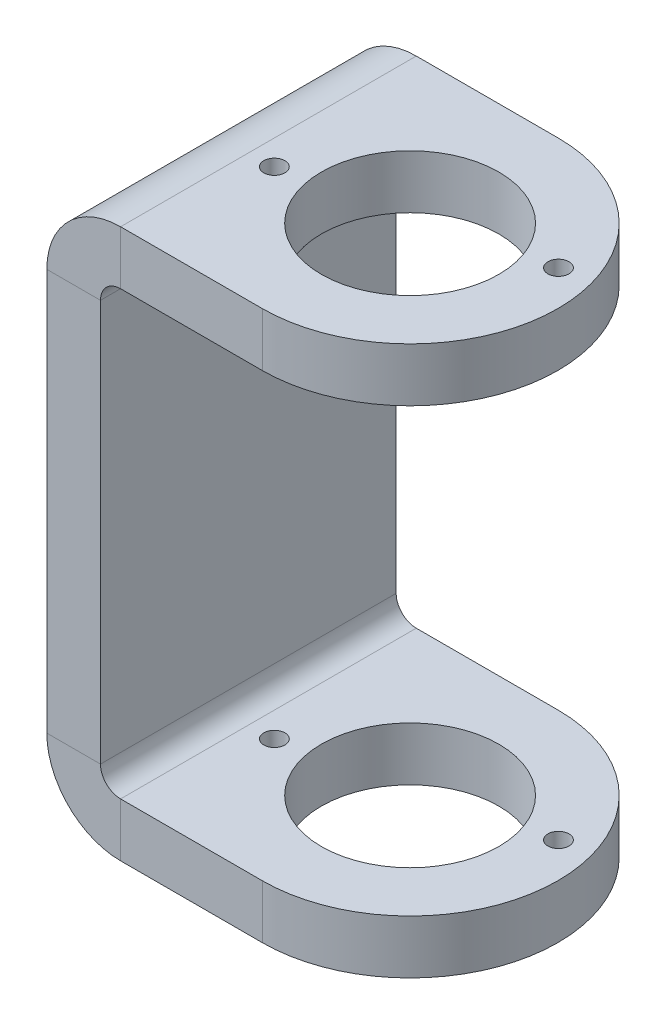
ISO-10303-21;
HEADER;
FILE_DESCRIPTION(('STEP AP214'),'2;1');
FILE_NAME('part.step','',(''),(''),'','','');
FILE_SCHEMA(('AUTOMOTIVE_DESIGN { 1 0 10303 214 1 1 1 1 }'));
ENDSEC;
DATA;
#1=APPLICATION_CONTEXT('core data for automotive mechanical design processes');
#2=APPLICATION_PROTOCOL_DEFINITION('international standard','automotive_design',2000,#1);
#3=PRODUCT_CONTEXT('',#1,'mechanical');
#4=PRODUCT('Part','Part','',(#3));
#5=PRODUCT_RELATED_PRODUCT_CATEGORY('part','',(#4));
#6=PRODUCT_DEFINITION_FORMATION('','',#4);
#7=PRODUCT_DEFINITION_CONTEXT('part definition',#1,'design');
#8=PRODUCT_DEFINITION('design','',#6,#7);
#9=PRODUCT_DEFINITION_SHAPE('','',#8);
#10=(LENGTH_UNIT() NAMED_UNIT(*) SI_UNIT(.MILLI.,.METRE.));
#11=(NAMED_UNIT(*) PLANE_ANGLE_UNIT() SI_UNIT($,.RADIAN.));
#12=(NAMED_UNIT(*) SI_UNIT($,.STERADIAN.) SOLID_ANGLE_UNIT());
#13=UNCERTAINTY_MEASURE_WITH_UNIT(LENGTH_MEASURE(1.E-05),#10,'distance_accuracy_value','');
#14=(GEOMETRIC_REPRESENTATION_CONTEXT(3) GLOBAL_UNCERTAINTY_ASSIGNED_CONTEXT((#13)) GLOBAL_UNIT_ASSIGNED_CONTEXT((#10,
#11,#12)) REPRESENTATION_CONTEXT('',''));
#15=CARTESIAN_POINT('',(0.,0.,0.));
#16=DIRECTION('',(0.,0.,1.));
#17=DIRECTION('',(1.,0.,0.));
#18=AXIS2_PLACEMENT_3D('',#15,#16,#17);
#19=CARTESIAN_POINT('',(0.,32.5,17.5));
#20=DIRECTION('',(0.,-1.,0.));
#21=DIRECTION('',(1.,0.,0.));
#22=AXIS2_PLACEMENT_3D('',#19,#20,#21);
#23=PLANE('',#22);
#24=CARTESIAN_POINT('',(38.8519998502097,32.5,-4.21));
#25=DIRECTION('',(0.,1.,0.));
#26=DIRECTION('',(0.,0.,1.));
#27=AXIS2_PLACEMENT_3D('',#24,#25,#26);
#28=CIRCLE('',#27,1.24999999999999);
#29=CARTESIAN_POINT('',(38.8519998502097,32.5,-2.96));
#30=VERTEX_POINT('',#29);
#31=EDGE_CURVE('E347',#30,#30,#28,.T.);
#32=ORIENTED_EDGE('',*,*,#31,.F.);
#33=EDGE_LOOP('',(#32));
#34=FACE_BOUND('',#33,.T.);
#35=CARTESIAN_POINT('',(25.5,32.5,0.));
#36=DIRECTION('',(0.,1.,0.));
#37=DIRECTION('',(0.,0.,1.));
#38=AXIS2_PLACEMENT_3D('',#35,#36,#37);
#39=CIRCLE('',#38,10.5);
#40=CARTESIAN_POINT('',(25.5,32.5,10.5));
#41=VERTEX_POINT('',#40);
#42=EDGE_CURVE('E331',#41,#41,#39,.T.);
#43=ORIENTED_EDGE('',*,*,#42,.F.);
#44=EDGE_LOOP('',(#43));
#45=FACE_BOUND('',#44,.T.);
#46=DIRECTION('',(-1.,0.,0.));
#47=VECTOR('',#46,1.);
#48=CARTESIAN_POINT('',(0.,32.5,17.5));
#49=LINE('',#48,#47);
#50=CARTESIAN_POINT('',(25.5,32.5,17.5));
#51=VERTEX_POINT('',#50);
#52=CARTESIAN_POINT('',(8.73000006599998,32.5,17.5));
#53=VERTEX_POINT('',#52);
#54=EDGE_CURVE('E194',#51,#53,#49,.T.);
#55=ORIENTED_EDGE('',*,*,#54,.F.);
#56=CARTESIAN_POINT('',(25.5,32.5,0.));
#57=DIRECTION('',(0.,-1.,0.));
#58=DIRECTION('',(1.,0.,0.));
#59=AXIS2_PLACEMENT_3D('',#56,#57,#58);
#60=CIRCLE('',#59,17.5);
#61=CARTESIAN_POINT('',(25.5,32.5,-17.5));
#62=VERTEX_POINT('',#61);
#63=EDGE_CURVE('E299',#51,#62,#60,.F.);
#64=ORIENTED_EDGE('',*,*,#63,.T.);
#65=DIRECTION('',(-1.,0.,0.));
#66=VECTOR('',#65,1.);
#67=CARTESIAN_POINT('',(0.,32.5,-17.5));
#68=LINE('',#67,#66);
#69=CARTESIAN_POINT('',(8.73000006599998,32.5,-17.5));
#70=VERTEX_POINT('',#69);
#71=EDGE_CURVE('E228',#62,#70,#68,.T.);
#72=ORIENTED_EDGE('',*,*,#71,.T.);
#73=DIRECTION('',(0.,0.,-1.));
#74=VECTOR('',#73,1.);
#75=CARTESIAN_POINT('',(8.73000006599998,32.5,17.5));
#76=LINE('',#75,#74);
#77=EDGE_CURVE('E254',#53,#70,#76,.T.);
#78=ORIENTED_EDGE('',*,*,#77,.F.);
#79=EDGE_LOOP('',(#55,#64,#72,#78));
#80=FACE_BOUND('',#79,.T.);
#81=CARTESIAN_POINT('',(11.6819863945645,32.5,2.25));
#82=DIRECTION('',(0.,1.,0.));
#83=DIRECTION('',(0.,0.,1.));
#84=AXIS2_PLACEMENT_3D('',#81,#82,#83);
#85=CIRCLE('',#84,1.24999999999999);
#86=CARTESIAN_POINT('',(11.6819863945645,32.5,3.49999999999999));
#87=VERTEX_POINT('',#86);
#88=EDGE_CURVE('E339',#87,#87,#85,.T.);
#89=ORIENTED_EDGE('',*,*,#88,.F.);
#90=EDGE_LOOP('',(#89));
#91=FACE_BOUND('',#90,.T.);
#92=ADVANCED_FACE('F51',(#34,#45,#80,#91),#23,.F.);
#93=CARTESIAN_POINT('',(25.5,-26.15,0.));
#94=DIRECTION('',(0.,-1.,0.));
#95=DIRECTION('',(0.,0.,-1.));
#96=AXIS2_PLACEMENT_3D('',#93,#94,#95);
#97=CYLINDRICAL_SURFACE('',#96,17.5);
#98=DIRECTION('',(0.,-1.,0.));
#99=VECTOR('',#98,1.);
#100=CARTESIAN_POINT('',(25.5,-23.769999934,-17.5));
#101=LINE('',#100,#99);
#102=CARTESIAN_POINT('',(25.5,-26.15,-17.5));
#103=VERTEX_POINT('',#102);
#104=CARTESIAN_POINT('',(25.5,-32.5,-17.5));
#105=VERTEX_POINT('',#104);
#106=EDGE_CURVE('E302',#103,#105,#101,.T.);
#107=ORIENTED_EDGE('',*,*,#106,.F.);
#108=CARTESIAN_POINT('',(25.5,-26.15,0.));
#109=DIRECTION('',(0.,1.,0.));
#110=DIRECTION('',(0.,0.,1.));
#111=AXIS2_PLACEMENT_3D('',#108,#109,#110);
#112=CIRCLE('',#111,17.5);
#113=CARTESIAN_POINT('',(25.5,-26.15,17.5));
#114=VERTEX_POINT('',#113);
#115=EDGE_CURVE('E61',#114,#103,#112,.T.);
#116=ORIENTED_EDGE('',*,*,#115,.F.);
#117=DIRECTION('',(0.,-1.,0.));
#118=VECTOR('',#117,1.);
#119=CARTESIAN_POINT('',(25.5,-23.769999934,17.5));
#120=LINE('',#119,#118);
#121=CARTESIAN_POINT('',(25.5,-32.5,17.5));
#122=VERTEX_POINT('',#121);
#123=EDGE_CURVE('E173',#122,#114,#120,.F.);
#124=ORIENTED_EDGE('',*,*,#123,.F.);
#125=CARTESIAN_POINT('',(25.5,-32.5,0.));
#126=DIRECTION('',(0.,1.,0.));
#127=DIRECTION('',(0.,0.,1.));
#128=AXIS2_PLACEMENT_3D('',#125,#126,#127);
#129=CIRCLE('',#128,17.5);
#130=EDGE_CURVE('E11',#105,#122,#129,.F.);
#131=ORIENTED_EDGE('',*,*,#130,.F.);
#132=EDGE_LOOP('',(#107,#116,#124,#131));
#133=FACE_BOUND('',#132,.T.);
#134=ADVANCED_FACE('F54',(#133),#97,.T.);
#135=CARTESIAN_POINT('',(25.5,26.15,0.));
#136=DIRECTION('',(0.,-1.,0.));
#137=DIRECTION('',(1.,0.,0.));
#138=AXIS2_PLACEMENT_3D('',#135,#136,#137);
#139=CYLINDRICAL_SURFACE('',#138,17.5);
#140=DIRECTION('',(0.,-1.,0.));
#141=VECTOR('',#140,1.);
#142=CARTESIAN_POINT('',(25.5,23.769999934,17.5));
#143=LINE('',#142,#141);
#144=CARTESIAN_POINT('',(25.5,26.15,17.5));
#145=VERTEX_POINT('',#144);
#146=EDGE_CURVE('E288',#145,#51,#143,.F.);
#147=ORIENTED_EDGE('',*,*,#146,.F.);
#148=CARTESIAN_POINT('',(25.5,26.15,0.));
#149=DIRECTION('',(0.,-1.,0.));
#150=DIRECTION('',(1.,0.,0.));
#151=AXIS2_PLACEMENT_3D('',#148,#149,#150);
#152=CIRCLE('',#151,17.5);
#153=CARTESIAN_POINT('',(25.5,26.15,-17.5));
#154=VERTEX_POINT('',#153);
#155=EDGE_CURVE('E296',#154,#145,#152,.T.);
#156=ORIENTED_EDGE('',*,*,#155,.F.);
#157=DIRECTION('',(0.,1.,0.));
#158=VECTOR('',#157,1.);
#159=CARTESIAN_POINT('',(25.5,26.15,-17.5));
#160=LINE('',#159,#158);
#161=EDGE_CURVE('E292',#62,#154,#160,.F.);
#162=ORIENTED_EDGE('',*,*,#161,.F.);
#163=ORIENTED_EDGE('',*,*,#63,.F.);
#164=EDGE_LOOP('',(#147,#156,#162,#163));
#165=FACE_BOUND('',#164,.T.);
#166=ADVANCED_FACE('F400',(#165),#139,.T.);
#167=CARTESIAN_POINT('',(8.73000006599998,32.5,17.5));
#168=DIRECTION('',(0.,0.,1.));
#169=DIRECTION('',(1.,0.,0.));
#170=AXIS2_PLACEMENT_3D('',#167,#168,#169);
#171=PLANE('',#170);
#172=DIRECTION('',(0.,-1.,0.));
#173=VECTOR('',#172,1.);
#174=CARTESIAN_POINT('',(8.73000006599998,32.5,17.5));
#175=LINE('',#174,#173);
#176=CARTESIAN_POINT('',(8.73000006599999,26.15,17.5));
#177=VERTEX_POINT('',#176);
#178=EDGE_CURVE('E284',#53,#177,#175,.T.);
#179=ORIENTED_EDGE('',*,*,#178,.F.);
#180=CARTESIAN_POINT('',(8.73000006599999,23.769999934,17.5));
#181=DIRECTION('',(0.,0.,-1.));
#182=DIRECTION('',(-1.,0.,0.));
#183=AXIS2_PLACEMENT_3D('',#180,#181,#182);
#184=CIRCLE('',#183,8.730000066);
#185=CARTESIAN_POINT('',(0.,23.769999934,17.5));
#186=VERTEX_POINT('',#185);
#187=EDGE_CURVE('E197',#53,#186,#184,.F.);
#188=ORIENTED_EDGE('',*,*,#187,.T.);
#189=DIRECTION('',(-1.,0.,0.));
#190=VECTOR('',#189,1.);
#191=CARTESIAN_POINT('',(6.34999999999999,23.769999934,17.5));
#192=LINE('',#191,#190);
#193=CARTESIAN_POINT('',(6.34999999999999,23.769999934,17.5));
#194=VERTEX_POINT('',#193);
#195=EDGE_CURVE('E281',#194,#186,#192,.T.);
#196=ORIENTED_EDGE('',*,*,#195,.F.);
#197=CARTESIAN_POINT('',(8.73000006599999,23.769999934,17.5));
#198=DIRECTION('',(0.,0.,1.));
#199=DIRECTION('',(1.,0.,0.));
#200=AXIS2_PLACEMENT_3D('',#197,#198,#199);
#201=CIRCLE('',#200,2.380000066);
#202=EDGE_CURVE('E184',#177,#194,#201,.T.);
#203=ORIENTED_EDGE('',*,*,#202,.F.);
#204=EDGE_LOOP('',(#179,#188,#196,#203));
#205=FACE_BOUND('',#204,.T.);
#206=ADVANCED_FACE('F445',(#205),#171,.T.);
#207=CARTESIAN_POINT('',(6.34999999999999,23.769999934,17.5));
#208=DIRECTION('',(0.,0.,1.));
#209=DIRECTION('',(1.,0.,0.));
#210=AXIS2_PLACEMENT_3D('',#207,#208,#209);
#211=PLANE('',#210);
#212=DIRECTION('',(-1.,0.,0.));
#213=VECTOR('',#212,1.);
#214=CARTESIAN_POINT('',(0.,26.15,17.5));
#215=LINE('',#214,#213);
#216=EDGE_CURVE('E191',#145,#177,#215,.T.);
#217=ORIENTED_EDGE('',*,*,#216,.F.);
#218=ORIENTED_EDGE('',*,*,#146,.T.);
#219=ORIENTED_EDGE('',*,*,#54,.T.);
#220=ORIENTED_EDGE('',*,*,#178,.T.);
#221=EDGE_LOOP('',(#217,#218,#219,#220));
#222=FACE_BOUND('',#221,.T.);
#223=ADVANCED_FACE('F441',(#222),#211,.T.);
#224=CARTESIAN_POINT('',(0.,23.769999934,-17.5));
#225=DIRECTION('',(0.,0.,-1.));
#226=DIRECTION('',(-1.,0.,0.));
#227=AXIS2_PLACEMENT_3D('',#224,#225,#226);
#228=PLANE('',#227);
#229=DIRECTION('',(1.,0.,0.));
#230=VECTOR('',#229,1.);
#231=CARTESIAN_POINT('',(0.,23.769999934,-17.5));
#232=LINE('',#231,#230);
#233=CARTESIAN_POINT('',(0.,23.769999934,-17.5));
#234=VERTEX_POINT('',#233);
#235=CARTESIAN_POINT('',(6.34999999999999,23.769999934,-17.5));
#236=VERTEX_POINT('',#235);
#237=EDGE_CURVE('E278',#234,#236,#232,.T.);
#238=ORIENTED_EDGE('',*,*,#237,.F.);
#239=CARTESIAN_POINT('',(8.73000006599999,23.769999934,-17.5));
#240=DIRECTION('',(0.,0.,-1.));
#241=DIRECTION('',(-1.,0.,0.));
#242=AXIS2_PLACEMENT_3D('',#239,#240,#241);
#243=CIRCLE('',#242,8.730000066);
#244=EDGE_CURVE('E231',#70,#234,#243,.F.);
#245=ORIENTED_EDGE('',*,*,#244,.F.);
#246=DIRECTION('',(0.,1.,0.));
#247=VECTOR('',#246,1.);
#248=CARTESIAN_POINT('',(8.73000006599999,26.15,-17.5));
#249=LINE('',#248,#247);
#250=CARTESIAN_POINT('',(8.73000006599999,26.15,-17.5));
#251=VERTEX_POINT('',#250);
#252=EDGE_CURVE('E274',#251,#70,#249,.T.);
#253=ORIENTED_EDGE('',*,*,#252,.F.);
#254=CARTESIAN_POINT('',(8.73000006599999,23.769999934,-17.5));
#255=DIRECTION('',(0.,0.,1.));
#256=DIRECTION('',(1.,0.,0.));
#257=AXIS2_PLACEMENT_3D('',#254,#255,#256);
#258=CIRCLE('',#257,2.380000066);
#259=EDGE_CURVE('E221',#251,#236,#258,.T.);
#260=ORIENTED_EDGE('',*,*,#259,.T.);
#261=EDGE_LOOP('',(#238,#245,#253,#260));
#262=FACE_BOUND('',#261,.T.);
#263=ADVANCED_FACE('F437',(#262),#228,.T.);
#264=CARTESIAN_POINT('',(8.73000006599999,26.15,-17.5));
#265=DIRECTION('',(0.,0.,-1.));
#266=DIRECTION('',(-1.,0.,0.));
#267=AXIS2_PLACEMENT_3D('',#264,#265,#266);
#268=PLANE('',#267);
#269=DIRECTION('',(0.,-1.,0.));
#270=VECTOR('',#269,1.);
#271=CARTESIAN_POINT('',(0.,-32.5,-17.5));
#272=LINE('',#271,#270);
#273=CARTESIAN_POINT('',(0.,-23.769999934,-17.5));
#274=VERTEX_POINT('',#273);
#275=EDGE_CURVE('E235',#234,#274,#272,.T.);
#276=ORIENTED_EDGE('',*,*,#275,.F.);
#277=ORIENTED_EDGE('',*,*,#237,.T.);
#278=DIRECTION('',(0.,-1.,0.));
#279=VECTOR('',#278,1.);
#280=CARTESIAN_POINT('',(6.35,-32.5,-17.5));
#281=LINE('',#280,#279);
#282=CARTESIAN_POINT('',(6.35,-23.769999934,-17.5));
#283=VERTEX_POINT('',#282);
#284=EDGE_CURVE('E217',#236,#283,#281,.T.);
#285=ORIENTED_EDGE('',*,*,#284,.T.);
#286=DIRECTION('',(-1.,0.,0.));
#287=VECTOR('',#286,1.);
#288=CARTESIAN_POINT('',(6.35,-23.769999934,-17.5));
#289=LINE('',#288,#287);
#290=EDGE_CURVE('E169',#283,#274,#289,.T.);
#291=ORIENTED_EDGE('',*,*,#290,.T.);
#292=EDGE_LOOP('',(#276,#277,#285,#291));
#293=FACE_BOUND('',#292,.T.);
#294=ADVANCED_FACE('F434',(#293),#268,.T.);
#295=CARTESIAN_POINT('',(0.,-23.769999934,17.5));
#296=DIRECTION('',(0.,0.,1.));
#297=DIRECTION('',(1.,0.,0.));
#298=AXIS2_PLACEMENT_3D('',#295,#296,#297);
#299=PLANE('',#298);
#300=DIRECTION('',(1.,0.,0.));
#301=VECTOR('',#300,1.);
#302=CARTESIAN_POINT('',(0.,-23.769999934,17.5));
#303=LINE('',#302,#301);
#304=CARTESIAN_POINT('',(0.,-23.769999934,17.5));
#305=VERTEX_POINT('',#304);
#306=CARTESIAN_POINT('',(6.35,-23.769999934,17.5));
#307=VERTEX_POINT('',#306);
#308=EDGE_CURVE('E153',#305,#307,#303,.T.);
#309=ORIENTED_EDGE('',*,*,#308,.F.);
#310=CARTESIAN_POINT('',(8.730000066,-23.769999934,17.5));
#311=DIRECTION('',(0.,0.,-1.));
#312=DIRECTION('',(-1.,0.,0.));
#313=AXIS2_PLACEMENT_3D('',#310,#311,#312);
#314=CIRCLE('',#313,8.730000066);
#315=CARTESIAN_POINT('',(8.730000066,-32.5,17.5));
#316=VERTEX_POINT('',#315);
#317=EDGE_CURVE('E147',#305,#316,#314,.F.);
#318=ORIENTED_EDGE('',*,*,#317,.T.);
#319=DIRECTION('',(0.,-1.,0.));
#320=VECTOR('',#319,1.);
#321=CARTESIAN_POINT('',(8.730000066,-26.15,17.5));
#322=LINE('',#321,#320);
#323=CARTESIAN_POINT('',(8.730000066,-26.15,17.5));
#324=VERTEX_POINT('',#323);
#325=EDGE_CURVE('E140',#324,#316,#322,.T.);
#326=ORIENTED_EDGE('',*,*,#325,.F.);
#327=CARTESIAN_POINT('',(8.730000066,-23.769999934,17.5));
#328=DIRECTION('',(0.,0.,1.));
#329=DIRECTION('',(1.,0.,0.));
#330=AXIS2_PLACEMENT_3D('',#327,#328,#329);
#331=CIRCLE('',#330,2.380000066);
#332=EDGE_CURVE('E144',#307,#324,#331,.T.);
#333=ORIENTED_EDGE('',*,*,#332,.F.);
#334=EDGE_LOOP('',(#309,#318,#326,#333));
#335=FACE_BOUND('',#334,.T.);
#336=ADVANCED_FACE('F142',(#335),#299,.T.);
#337=CARTESIAN_POINT('',(8.730000066,-26.15,17.5));
#338=DIRECTION('',(0.,0.,1.));
#339=DIRECTION('',(1.,0.,0.));
#340=AXIS2_PLACEMENT_3D('',#337,#338,#339);
#341=PLANE('',#340);
#342=DIRECTION('',(0.,-1.,0.));
#343=VECTOR('',#342,1.);
#344=CARTESIAN_POINT('',(0.,-32.5,17.5));
#345=LINE('',#344,#343);
#346=EDGE_CURVE('E201',#186,#305,#345,.T.);
#347=ORIENTED_EDGE('',*,*,#346,.T.);
#348=ORIENTED_EDGE('',*,*,#308,.T.);
#349=DIRECTION('',(0.,-1.,0.));
#350=VECTOR('',#349,1.);
#351=CARTESIAN_POINT('',(6.35,-32.5,17.5));
#352=LINE('',#351,#350);
#353=EDGE_CURVE('E181',#194,#307,#352,.T.);
#354=ORIENTED_EDGE('',*,*,#353,.F.);
#355=ORIENTED_EDGE('',*,*,#195,.T.);
#356=EDGE_LOOP('',(#347,#348,#354,#355));
#357=FACE_BOUND('',#356,.T.);
#358=ADVANCED_FACE('F428',(#357),#341,.T.);
#359=CARTESIAN_POINT('',(8.730000066,-32.5,-17.5));
#360=DIRECTION('',(0.,0.,-1.));
#361=DIRECTION('',(-1.,0.,0.));
#362=AXIS2_PLACEMENT_3D('',#359,#360,#361);
#363=PLANE('',#362);
#364=DIRECTION('',(0.,1.,0.));
#365=VECTOR('',#364,1.);
#366=CARTESIAN_POINT('',(8.730000066,-32.5,-17.5));
#367=LINE('',#366,#365);
#368=CARTESIAN_POINT('',(8.730000066,-32.5,-17.5));
#369=VERTEX_POINT('',#368);
#370=CARTESIAN_POINT('',(8.730000066,-26.15,-17.5));
#371=VERTEX_POINT('',#370);
#372=EDGE_CURVE('E154',#369,#371,#367,.T.);
#373=ORIENTED_EDGE('',*,*,#372,.F.);
#374=CARTESIAN_POINT('',(8.730000066,-23.769999934,-17.5));
#375=DIRECTION('',(0.,0.,-1.));
#376=DIRECTION('',(-1.,0.,0.));
#377=AXIS2_PLACEMENT_3D('',#374,#375,#376);
#378=CIRCLE('',#377,8.730000066);
#379=EDGE_CURVE('E239',#274,#369,#378,.F.);
#380=ORIENTED_EDGE('',*,*,#379,.F.);
#381=ORIENTED_EDGE('',*,*,#290,.F.);
#382=CARTESIAN_POINT('',(8.730000066,-23.769999934,-17.5));
#383=DIRECTION('',(0.,0.,1.));
#384=DIRECTION('',(1.,0.,0.));
#385=AXIS2_PLACEMENT_3D('',#382,#383,#384);
#386=CIRCLE('',#385,2.380000066);
#387=EDGE_CURVE('E214',#283,#371,#386,.T.);
#388=ORIENTED_EDGE('',*,*,#387,.T.);
#389=EDGE_LOOP('',(#373,#380,#381,#388));
#390=FACE_BOUND('',#389,.T.);
#391=ADVANCED_FACE('F313',(#390),#363,.T.);
#392=CARTESIAN_POINT('',(6.35,-23.769999934,-17.5));
#393=DIRECTION('',(0.,0.,-1.));
#394=DIRECTION('',(-1.,0.,0.));
#395=AXIS2_PLACEMENT_3D('',#392,#393,#394);
#396=PLANE('',#395);
#397=DIRECTION('',(1.,0.,0.));
#398=VECTOR('',#397,1.);
#399=CARTESIAN_POINT('',(0.,-26.15,-17.5));
#400=LINE('',#399,#398);
#401=EDGE_CURVE('E164',#371,#103,#400,.T.);
#402=ORIENTED_EDGE('',*,*,#401,.T.);
#403=ORIENTED_EDGE('',*,*,#106,.T.);
#404=DIRECTION('',(1.,0.,0.));
#405=VECTOR('',#404,1.);
#406=CARTESIAN_POINT('',(0.,-32.5,-17.5));
#407=LINE('',#406,#405);
#408=EDGE_CURVE('E208',#369,#105,#407,.T.);
#409=ORIENTED_EDGE('',*,*,#408,.F.);
#410=ORIENTED_EDGE('',*,*,#372,.T.);
#411=EDGE_LOOP('',(#402,#403,#409,#410));
#412=FACE_BOUND('',#411,.T.);
#413=ADVANCED_FACE('F310',(#412),#396,.T.);
#414=CARTESIAN_POINT('',(0.,-32.5,17.5));
#415=DIRECTION('',(0.,1.,0.));
#416=DIRECTION('',(0.,0.,1.));
#417=AXIS2_PLACEMENT_3D('',#414,#415,#416);
#418=PLANE('',#417);
#419=CARTESIAN_POINT('',(11.6819863945645,-32.5,2.25));
#420=DIRECTION('',(0.,-1.,0.));
#421=DIRECTION('',(0.,0.,-1.));
#422=AXIS2_PLACEMENT_3D('',#419,#420,#421);
#423=CIRCLE('',#422,1.24999999999999);
#424=CARTESIAN_POINT('',(11.6819863945645,-32.5,1.00000000000001));
#425=VERTEX_POINT('',#424);
#426=EDGE_CURVE('E363',#425,#425,#423,.T.);
#427=ORIENTED_EDGE('',*,*,#426,.F.);
#428=EDGE_LOOP('',(#427));
#429=FACE_BOUND('',#428,.T.);
#430=CARTESIAN_POINT('',(38.8519998502097,-32.5,-4.21));
#431=DIRECTION('',(0.,-1.,0.));
#432=DIRECTION('',(0.,0.,-1.));
#433=AXIS2_PLACEMENT_3D('',#430,#431,#432);
#434=CIRCLE('',#433,1.24999999999999);
#435=CARTESIAN_POINT('',(38.8519998502097,-32.5,-5.45999999999999));
#436=VERTEX_POINT('',#435);
#437=EDGE_CURVE('E355',#436,#436,#434,.T.);
#438=ORIENTED_EDGE('',*,*,#437,.F.);
#439=EDGE_LOOP('',(#438));
#440=FACE_BOUND('',#439,.T.);
#441=CARTESIAN_POINT('',(25.5,-32.5,0.));
#442=DIRECTION('',(0.,1.,0.));
#443=DIRECTION('',(0.,0.,1.));
#444=AXIS2_PLACEMENT_3D('',#441,#442,#443);
#445=CIRCLE('',#444,10.5);
#446=CARTESIAN_POINT('',(25.5,-32.5,10.5));
#447=VERTEX_POINT('',#446);
#448=EDGE_CURVE('E327',#447,#447,#445,.T.);
#449=ORIENTED_EDGE('',*,*,#448,.T.);
#450=EDGE_LOOP('',(#449));
#451=FACE_BOUND('',#450,.T.);
#452=ORIENTED_EDGE('',*,*,#408,.T.);
#453=ORIENTED_EDGE('',*,*,#130,.T.);
#454=DIRECTION('',(1.,0.,0.));
#455=VECTOR('',#454,1.);
#456=CARTESIAN_POINT('',(0.,-32.5,17.5));
#457=LINE('',#456,#455);
#458=EDGE_CURVE('E175',#316,#122,#457,.T.);
#459=ORIENTED_EDGE('',*,*,#458,.F.);
#460=DIRECTION('',(0.,0.,-1.));
#461=VECTOR('',#460,1.);
#462=CARTESIAN_POINT('',(8.730000066,-32.5,17.5));
#463=LINE('',#462,#461);
#464=EDGE_CURVE('E207',#316,#369,#463,.T.);
#465=ORIENTED_EDGE('',*,*,#464,.T.);
#466=EDGE_LOOP('',(#452,#453,#459,#465));
#467=FACE_BOUND('',#466,.T.);
#468=ADVANCED_FACE('F317',(#429,#440,#451,#467),#418,.F.);
#469=CARTESIAN_POINT('',(0.,-26.15,17.5));
#470=DIRECTION('',(0.,1.,0.));
#471=DIRECTION('',(0.,0.,1.));
#472=AXIS2_PLACEMENT_3D('',#469,#470,#471);
#473=PLANE('',#472);
#474=CARTESIAN_POINT('',(11.6819863945645,-26.15,2.25));
#475=DIRECTION('',(0.,1.,0.));
#476=DIRECTION('',(0.,0.,1.));
#477=AXIS2_PLACEMENT_3D('',#474,#475,#476);
#478=CIRCLE('',#477,1.24999999999999);
#479=CARTESIAN_POINT('',(11.6819863945645,-26.15,3.49999999999999));
#480=VERTEX_POINT('',#479);
#481=EDGE_CURVE('E359',#480,#480,#478,.T.);
#482=ORIENTED_EDGE('',*,*,#481,.F.);
#483=EDGE_LOOP('',(#482));
#484=FACE_BOUND('',#483,.T.);
#485=CARTESIAN_POINT('',(38.8519998502097,-26.15,-4.21));
#486=DIRECTION('',(0.,1.,0.));
#487=DIRECTION('',(0.,0.,1.));
#488=AXIS2_PLACEMENT_3D('',#485,#486,#487);
#489=CIRCLE('',#488,1.24999999999999);
#490=CARTESIAN_POINT('',(38.8519998502097,-26.15,-2.96));
#491=VERTEX_POINT('',#490);
#492=EDGE_CURVE('E351',#491,#491,#489,.T.);
#493=ORIENTED_EDGE('',*,*,#492,.F.);
#494=EDGE_LOOP('',(#493));
#495=FACE_BOUND('',#494,.T.);
#496=CARTESIAN_POINT('',(25.5,-26.15,0.));
#497=DIRECTION('',(0.,1.,0.));
#498=DIRECTION('',(0.,0.,1.));
#499=AXIS2_PLACEMENT_3D('',#496,#497,#498);
#500=CIRCLE('',#499,10.5);
#501=CARTESIAN_POINT('',(25.5,-26.15,10.5));
#502=VERTEX_POINT('',#501);
#503=EDGE_CURVE('E211',#502,#502,#500,.T.);
#504=ORIENTED_EDGE('',*,*,#503,.F.);
#505=EDGE_LOOP('',(#504));
#506=FACE_BOUND('',#505,.T.);
#507=DIRECTION('',(1.,0.,0.));
#508=VECTOR('',#507,1.);
#509=CARTESIAN_POINT('',(0.,-26.15,17.5));
#510=LINE('',#509,#508);
#511=EDGE_CURVE('E162',#324,#114,#510,.T.);
#512=ORIENTED_EDGE('',*,*,#511,.T.);
#513=ORIENTED_EDGE('',*,*,#115,.T.);
#514=ORIENTED_EDGE('',*,*,#401,.F.);
#515=DIRECTION('',(0.,0.,-1.));
#516=VECTOR('',#515,1.);
#517=CARTESIAN_POINT('',(8.730000066,-26.15,17.5));
#518=LINE('',#517,#516);
#519=EDGE_CURVE('E160',#324,#371,#518,.T.);
#520=ORIENTED_EDGE('',*,*,#519,.F.);
#521=EDGE_LOOP('',(#512,#513,#514,#520));
#522=FACE_BOUND('',#521,.T.);
#523=ADVANCED_FACE('F161',(#484,#495,#506,#522),#473,.T.);
#524=CARTESIAN_POINT('',(8.730000066,-23.769999934,17.5));
#525=DIRECTION('',(0.,0.,-1.));
#526=DIRECTION('',(-1.,0.,0.));
#527=AXIS2_PLACEMENT_3D('',#524,#525,#526);
#528=CYLINDRICAL_SURFACE('',#527,2.380000066);
#529=ORIENTED_EDGE('',*,*,#387,.F.);
#530=DIRECTION('',(0.,0.,-1.));
#531=VECTOR('',#530,1.);
#532=CARTESIAN_POINT('',(6.35,-23.769999934,17.5));
#533=LINE('',#532,#531);
#534=EDGE_CURVE('E170',#307,#283,#533,.T.);
#535=ORIENTED_EDGE('',*,*,#534,.F.);
#536=ORIENTED_EDGE('',*,*,#332,.T.);
#537=ORIENTED_EDGE('',*,*,#519,.T.);
#538=EDGE_LOOP('',(#529,#535,#536,#537));
#539=FACE_BOUND('',#538,.T.);
#540=ADVANCED_FACE('F178',(#539),#528,.F.);
#541=CARTESIAN_POINT('',(6.35,-32.5,17.5));
#542=DIRECTION('',(1.,0.,0.));
#543=DIRECTION('',(0.,1.,0.));
#544=AXIS2_PLACEMENT_3D('',#541,#542,#543);
#545=PLANE('',#544);
#546=ORIENTED_EDGE('',*,*,#284,.F.);
#547=DIRECTION('',(0.,0.,-1.));
#548=VECTOR('',#547,1.);
#549=CARTESIAN_POINT('',(6.34999999999999,23.769999934,17.5));
#550=LINE('',#549,#548);
#551=EDGE_CURVE('E262',#194,#236,#550,.T.);
#552=ORIENTED_EDGE('',*,*,#551,.F.);
#553=ORIENTED_EDGE('',*,*,#353,.T.);
#554=ORIENTED_EDGE('',*,*,#534,.T.);
#555=EDGE_LOOP('',(#546,#552,#553,#554));
#556=FACE_BOUND('',#555,.T.);
#557=ADVANCED_FACE('F414',(#556),#545,.T.);
#558=CARTESIAN_POINT('',(8.73000006599999,23.769999934,17.5));
#559=DIRECTION('',(0.,0.,-1.));
#560=DIRECTION('',(-1.,0.,0.));
#561=AXIS2_PLACEMENT_3D('',#558,#559,#560);
#562=CYLINDRICAL_SURFACE('',#561,2.380000066);
#563=ORIENTED_EDGE('',*,*,#259,.F.);
#564=DIRECTION('',(0.,0.,-1.));
#565=VECTOR('',#564,1.);
#566=CARTESIAN_POINT('',(8.73000006599999,26.15,17.5));
#567=LINE('',#566,#565);
#568=EDGE_CURVE('E258',#177,#251,#567,.T.);
#569=ORIENTED_EDGE('',*,*,#568,.F.);
#570=ORIENTED_EDGE('',*,*,#202,.T.);
#571=ORIENTED_EDGE('',*,*,#551,.T.);
#572=EDGE_LOOP('',(#563,#569,#570,#571));
#573=FACE_BOUND('',#572,.T.);
#574=ADVANCED_FACE('F410',(#573),#562,.F.);
#575=CARTESIAN_POINT('',(0.,26.15,17.5));
#576=DIRECTION('',(0.,-1.,0.));
#577=DIRECTION('',(1.,0.,0.));
#578=AXIS2_PLACEMENT_3D('',#575,#576,#577);
#579=PLANE('',#578);
#580=CARTESIAN_POINT('',(38.8519998502097,26.15,-4.21));
#581=DIRECTION('',(0.,-1.,0.));
#582=DIRECTION('',(1.,0.,0.));
#583=AXIS2_PLACEMENT_3D('',#580,#581,#582);
#584=CIRCLE('',#583,1.25);
#585=CARTESIAN_POINT('',(40.1019998502097,26.15,-4.21));
#586=VERTEX_POINT('',#585);
#587=EDGE_CURVE('E343',#586,#586,#584,.T.);
#588=ORIENTED_EDGE('',*,*,#587,.F.);
#589=EDGE_LOOP('',(#588));
#590=FACE_BOUND('',#589,.T.);
#591=CARTESIAN_POINT('',(11.6819863945645,26.15,2.25));
#592=DIRECTION('',(0.,-1.,0.));
#593=DIRECTION('',(1.,0.,0.));
#594=AXIS2_PLACEMENT_3D('',#591,#592,#593);
#595=CIRCLE('',#594,1.25);
#596=CARTESIAN_POINT('',(12.9319863945645,26.15,2.25));
#597=VERTEX_POINT('',#596);
#598=EDGE_CURVE('E335',#597,#597,#595,.T.);
#599=ORIENTED_EDGE('',*,*,#598,.F.);
#600=EDGE_LOOP('',(#599));
#601=FACE_BOUND('',#600,.T.);
#602=CARTESIAN_POINT('',(25.5,26.15,0.));
#603=DIRECTION('',(0.,-1.,0.));
#604=DIRECTION('',(1.,0.,0.));
#605=AXIS2_PLACEMENT_3D('',#602,#603,#604);
#606=CIRCLE('',#605,10.5);
#607=CARTESIAN_POINT('',(36.,26.15,0.));
#608=VERTEX_POINT('',#607);
#609=EDGE_CURVE('E323',#608,#608,#606,.T.);
#610=ORIENTED_EDGE('',*,*,#609,.F.);
#611=EDGE_LOOP('',(#610));
#612=FACE_BOUND('',#611,.T.);
#613=DIRECTION('',(-1.,0.,0.));
#614=VECTOR('',#613,1.);
#615=CARTESIAN_POINT('',(0.,26.15,-17.5));
#616=LINE('',#615,#614);
#617=EDGE_CURVE('E225',#154,#251,#616,.T.);
#618=ORIENTED_EDGE('',*,*,#617,.F.);
#619=ORIENTED_EDGE('',*,*,#155,.T.);
#620=ORIENTED_EDGE('',*,*,#216,.T.);
#621=ORIENTED_EDGE('',*,*,#568,.T.);
#622=EDGE_LOOP('',(#618,#619,#620,#621));
#623=FACE_BOUND('',#622,.T.);
#624=ADVANCED_FACE('F407',(#590,#601,#612,#623),#579,.T.);
#625=CARTESIAN_POINT('',(8.73000006599999,23.769999934,17.5));
#626=DIRECTION('',(0.,0.,-1.));
#627=DIRECTION('',(-1.,0.,0.));
#628=AXIS2_PLACEMENT_3D('',#625,#626,#627);
#629=CYLINDRICAL_SURFACE('',#628,8.730000066);
#630=ORIENTED_EDGE('',*,*,#244,.T.);
#631=DIRECTION('',(0.,0.,-1.));
#632=VECTOR('',#631,1.);
#633=CARTESIAN_POINT('',(0.,23.769999934,17.5));
#634=LINE('',#633,#632);
#635=EDGE_CURVE('E250',#186,#234,#634,.T.);
#636=ORIENTED_EDGE('',*,*,#635,.F.);
#637=ORIENTED_EDGE('',*,*,#187,.F.);
#638=ORIENTED_EDGE('',*,*,#77,.T.);
#639=EDGE_LOOP('',(#630,#636,#637,#638));
#640=FACE_BOUND('',#639,.T.);
#641=ADVANCED_FACE('F405',(#640),#629,.T.);
#642=CARTESIAN_POINT('',(0.,-32.5,17.5));
#643=DIRECTION('',(1.,0.,0.));
#644=DIRECTION('',(0.,1.,0.));
#645=AXIS2_PLACEMENT_3D('',#642,#643,#644);
#646=PLANE('',#645);
#647=ORIENTED_EDGE('',*,*,#275,.T.);
#648=DIRECTION('',(0.,0.,-1.));
#649=VECTOR('',#648,1.);
#650=CARTESIAN_POINT('',(0.,-23.769999934,17.5));
#651=LINE('',#650,#649);
#652=EDGE_CURVE('E246',#305,#274,#651,.T.);
#653=ORIENTED_EDGE('',*,*,#652,.F.);
#654=ORIENTED_EDGE('',*,*,#346,.F.);
#655=ORIENTED_EDGE('',*,*,#635,.T.);
#656=EDGE_LOOP('',(#647,#653,#654,#655));
#657=FACE_BOUND('',#656,.T.);
#658=ADVANCED_FACE('F476',(#657),#646,.F.);
#659=CARTESIAN_POINT('',(8.730000066,-23.769999934,17.5));
#660=DIRECTION('',(0.,0.,-1.));
#661=DIRECTION('',(-1.,0.,0.));
#662=AXIS2_PLACEMENT_3D('',#659,#660,#661);
#663=CYLINDRICAL_SURFACE('',#662,8.730000066);
#664=ORIENTED_EDGE('',*,*,#379,.T.);
#665=ORIENTED_EDGE('',*,*,#464,.F.);
#666=ORIENTED_EDGE('',*,*,#317,.F.);
#667=ORIENTED_EDGE('',*,*,#652,.T.);
#668=EDGE_LOOP('',(#664,#665,#666,#667));
#669=FACE_BOUND('',#668,.T.);
#670=ADVANCED_FACE('F315',(#669),#663,.T.);
#671=CARTESIAN_POINT('',(8.730000066,-23.769999934,17.5));
#672=DIRECTION('',(0.,0.,1.));
#673=DIRECTION('',(1.,0.,0.));
#674=AXIS2_PLACEMENT_3D('',#671,#672,#673);
#675=PLANE('',#674);
#676=ORIENTED_EDGE('',*,*,#458,.T.);
#677=ORIENTED_EDGE('',*,*,#123,.T.);
#678=ORIENTED_EDGE('',*,*,#511,.F.);
#679=ORIENTED_EDGE('',*,*,#325,.T.);
#680=EDGE_LOOP('',(#676,#677,#678,#679));
#681=FACE_BOUND('',#680,.T.);
#682=ADVANCED_FACE('F172',(#681),#675,.T.);
#683=CARTESIAN_POINT('',(8.730000066,-23.769999934,-17.5));
#684=DIRECTION('',(0.,0.,1.));
#685=DIRECTION('',(1.,0.,0.));
#686=AXIS2_PLACEMENT_3D('',#683,#684,#685);
#687=PLANE('',#686);
#688=ORIENTED_EDGE('',*,*,#71,.F.);
#689=ORIENTED_EDGE('',*,*,#161,.T.);
#690=ORIENTED_EDGE('',*,*,#617,.T.);
#691=ORIENTED_EDGE('',*,*,#252,.T.);
#692=EDGE_LOOP('',(#688,#689,#690,#691));
#693=FACE_BOUND('',#692,.T.);
#694=ADVANCED_FACE('F391',(#693),#687,.F.);
#695=CARTESIAN_POINT('',(25.5,-32.5,0.));
#696=DIRECTION('',(0.,1.,0.));
#697=DIRECTION('',(0.,0.,1.));
#698=AXIS2_PLACEMENT_3D('',#695,#696,#697);
#699=CYLINDRICAL_SURFACE('',#698,10.5);
#700=ORIENTED_EDGE('',*,*,#609,.T.);
#701=EDGE_LOOP('',(#700));
#702=FACE_BOUND('',#701,.T.);
#703=ORIENTED_EDGE('',*,*,#42,.T.);
#704=EDGE_LOOP('',(#703));
#705=FACE_BOUND('',#704,.T.);
#706=ADVANCED_FACE('F381',(#702,#705),#699,.F.);
#707=ORIENTED_EDGE('',*,*,#503,.T.);
#708=EDGE_LOOP('',(#707));
#709=FACE_BOUND('',#708,.T.);
#710=ORIENTED_EDGE('',*,*,#448,.F.);
#711=EDGE_LOOP('',(#710));
#712=FACE_BOUND('',#711,.T.);
#713=ADVANCED_FACE('F378',(#709,#712),#699,.F.);
#714=CARTESIAN_POINT('',(11.6819863945645,32.5,2.25));
#715=DIRECTION('',(0.,1.,0.));
#716=DIRECTION('',(0.,0.,1.));
#717=AXIS2_PLACEMENT_3D('',#714,#715,#716);
#718=CYLINDRICAL_SURFACE('',#717,1.25);
#719=ORIENTED_EDGE('',*,*,#88,.T.);
#720=EDGE_LOOP('',(#719));
#721=FACE_BOUND('',#720,.T.);
#722=ORIENTED_EDGE('',*,*,#598,.T.);
#723=EDGE_LOOP('',(#722));
#724=FACE_BOUND('',#723,.T.);
#725=ADVANCED_FACE('F380',(#721,#724),#718,.F.);
#726=CARTESIAN_POINT('',(38.8519998502097,32.5,-4.21));
#727=DIRECTION('',(0.,1.,0.));
#728=DIRECTION('',(0.,0.,1.));
#729=AXIS2_PLACEMENT_3D('',#726,#727,#728);
#730=CYLINDRICAL_SURFACE('',#729,1.25);
#731=ORIENTED_EDGE('',*,*,#31,.T.);
#732=EDGE_LOOP('',(#731));
#733=FACE_BOUND('',#732,.T.);
#734=ORIENTED_EDGE('',*,*,#587,.T.);
#735=EDGE_LOOP('',(#734));
#736=FACE_BOUND('',#735,.T.);
#737=ADVANCED_FACE('F388',(#733,#736),#730,.F.);
#738=CARTESIAN_POINT('',(38.8519998502097,-32.5,-4.21));
#739=DIRECTION('',(0.,-1.,0.));
#740=DIRECTION('',(0.,0.,-1.));
#741=AXIS2_PLACEMENT_3D('',#738,#739,#740);
#742=CYLINDRICAL_SURFACE('',#741,1.24999999999999);
#743=ORIENTED_EDGE('',*,*,#437,.T.);
#744=EDGE_LOOP('',(#743));
#745=FACE_BOUND('',#744,.T.);
#746=ORIENTED_EDGE('',*,*,#492,.T.);
#747=EDGE_LOOP('',(#746));
#748=FACE_BOUND('',#747,.T.);
#749=ADVANCED_FACE('F533',(#745,#748),#742,.F.);
#750=CARTESIAN_POINT('',(11.6819863945645,-32.5,2.25));
#751=DIRECTION('',(0.,-1.,0.));
#752=DIRECTION('',(0.,0.,-1.));
#753=AXIS2_PLACEMENT_3D('',#750,#751,#752);
#754=CYLINDRICAL_SURFACE('',#753,1.24999999999999);
#755=ORIENTED_EDGE('',*,*,#426,.T.);
#756=EDGE_LOOP('',(#755));
#757=FACE_BOUND('',#756,.T.);
#758=ORIENTED_EDGE('',*,*,#481,.T.);
#759=EDGE_LOOP('',(#758));
#760=FACE_BOUND('',#759,.T.);
#761=ADVANCED_FACE('F368',(#757,#760),#754,.F.);
#762=CLOSED_SHELL('',(#92,#134,#166,#206,#223,#263,#294,#336,#358,#391,#413,#468,#523,#540,#557,
#574,#624,#641,#658,#670,#682,#694,#706,#713,#725,#737,#749,#761));
#763=MANIFOLD_SOLID_BREP('B2',#762);
#764=ADVANCED_BREP_SHAPE_REPRESENTATION('',(#18,#763),#14);
#765=SHAPE_DEFINITION_REPRESENTATION(#9,#764);
ENDSEC;
END-ISO-10303-21;
